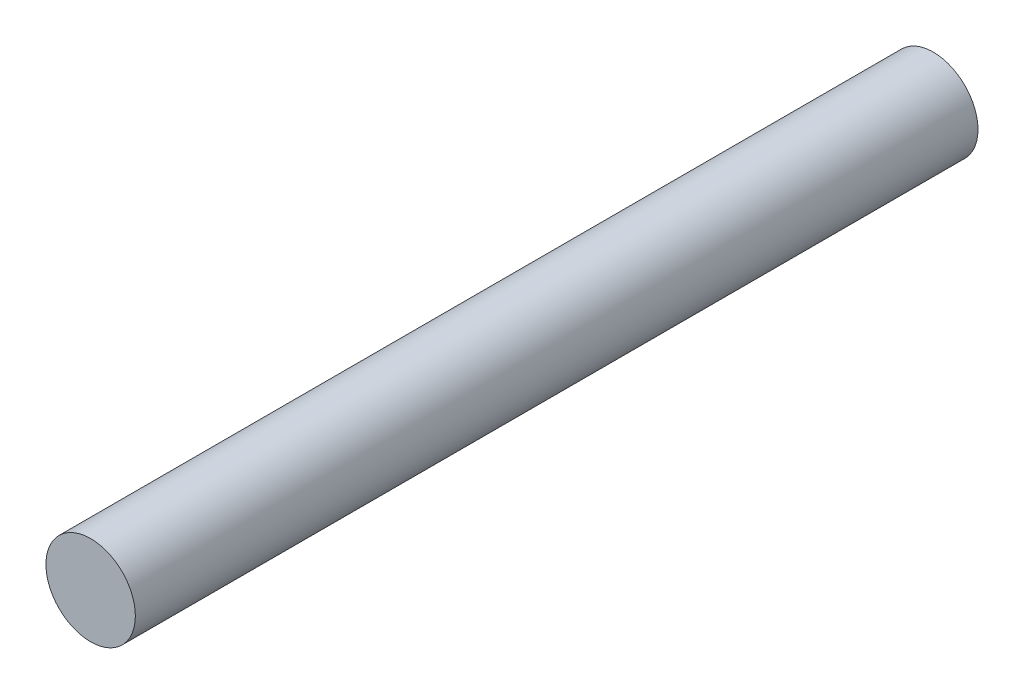
ISO-10303-21;
HEADER;
FILE_DESCRIPTION(('STEP AP214'),'2;1');
FILE_NAME('part.step','',(''),(''),'','','');
FILE_SCHEMA(('AUTOMOTIVE_DESIGN { 1 0 10303 214 1 1 1 1 }'));
ENDSEC;
DATA;
#1=APPLICATION_CONTEXT('core data for automotive mechanical design processes');
#2=APPLICATION_PROTOCOL_DEFINITION('international standard','automotive_design',2000,#1);
#3=PRODUCT_CONTEXT('',#1,'mechanical');
#4=PRODUCT('Part','Part','',(#3));
#5=PRODUCT_RELATED_PRODUCT_CATEGORY('part','',(#4));
#6=PRODUCT_DEFINITION_FORMATION('','',#4);
#7=PRODUCT_DEFINITION_CONTEXT('part definition',#1,'design');
#8=PRODUCT_DEFINITION('design','',#6,#7);
#9=PRODUCT_DEFINITION_SHAPE('','',#8);
#10=(LENGTH_UNIT() NAMED_UNIT(*) SI_UNIT(.MILLI.,.METRE.));
#11=(NAMED_UNIT(*) PLANE_ANGLE_UNIT() SI_UNIT($,.RADIAN.));
#12=(NAMED_UNIT(*) SI_UNIT($,.STERADIAN.) SOLID_ANGLE_UNIT());
#13=UNCERTAINTY_MEASURE_WITH_UNIT(LENGTH_MEASURE(1.E-05),#10,'distance_accuracy_value','');
#14=(GEOMETRIC_REPRESENTATION_CONTEXT(3) GLOBAL_UNCERTAINTY_ASSIGNED_CONTEXT((#13)) GLOBAL_UNIT_ASSIGNED_CONTEXT((#10,
#11,#12)) REPRESENTATION_CONTEXT('',''));
#15=CARTESIAN_POINT('',(0.,0.,0.));
#16=DIRECTION('',(0.,0.,1.));
#17=DIRECTION('',(1.,0.,0.));
#18=AXIS2_PLACEMENT_3D('',#15,#16,#17);
#19=CARTESIAN_POINT('',(0.,0.,650.));
#20=DIRECTION('',(0.,0.,-1.));
#21=DIRECTION('',(-1.,0.,0.));
#22=AXIS2_PLACEMENT_3D('',#19,#20,#21);
#23=CYLINDRICAL_SURFACE('',#22,34.5);
#24=CARTESIAN_POINT('',(0.,0.,650.));
#25=DIRECTION('',(0.,0.,1.));
#26=DIRECTION('',(1.,0.,0.));
#27=AXIS2_PLACEMENT_3D('',#24,#25,#26);
#28=CIRCLE('',#27,34.5);
#29=CARTESIAN_POINT('',(34.5,0.,650.));
#30=VERTEX_POINT('',#29);
#31=EDGE_CURVE('E10',#30,#30,#28,.T.);
#32=ORIENTED_EDGE('',*,*,#31,.F.);
#33=EDGE_LOOP('',(#32));
#34=FACE_BOUND('',#33,.T.);
#35=CARTESIAN_POINT('',(0.,0.,0.));
#36=DIRECTION('',(0.,0.,1.));
#37=DIRECTION('',(1.,0.,0.));
#38=AXIS2_PLACEMENT_3D('',#35,#36,#37);
#39=CIRCLE('',#38,34.5);
#40=CARTESIAN_POINT('',(34.5,0.,0.));
#41=VERTEX_POINT('',#40);
#42=EDGE_CURVE('E46',#41,#41,#39,.T.);
#43=ORIENTED_EDGE('',*,*,#42,.T.);
#44=EDGE_LOOP('',(#43));
#45=FACE_BOUND('',#44,.T.);
#46=ADVANCED_FACE('F43',(#34,#45),#23,.T.);
#47=CARTESIAN_POINT('',(0.,0.,650.));
#48=DIRECTION('',(0.,0.,1.));
#49=DIRECTION('',(1.,0.,0.));
#50=AXIS2_PLACEMENT_3D('',#47,#48,#49);
#51=PLANE('',#50);
#52=ORIENTED_EDGE('',*,*,#31,.T.);
#53=EDGE_LOOP('',(#52));
#54=FACE_BOUND('',#53,.T.);
#55=ADVANCED_FACE('F78',(#54),#51,.T.);
#56=CARTESIAN_POINT('',(0.,0.,0.));
#57=DIRECTION('',(0.,0.,1.));
#58=DIRECTION('',(1.,0.,0.));
#59=AXIS2_PLACEMENT_3D('',#56,#57,#58);
#60=PLANE('',#59);
#61=ORIENTED_EDGE('',*,*,#42,.F.);
#62=EDGE_LOOP('',(#61));
#63=FACE_BOUND('',#62,.T.);
#64=ADVANCED_FACE('F80',(#63),#60,.F.);
#65=CLOSED_SHELL('',(#46,#55,#64));
#66=CARTESIAN_POINT('',(0.,0.,648.));
#67=DIRECTION('',(0.,0.,-1.));
#68=DIRECTION('',(-1.,0.,0.));
#69=AXIS2_PLACEMENT_3D('',#66,#67,#68);
#70=CYLINDRICAL_SURFACE('',#69,32.5);
#71=CARTESIAN_POINT('',(0.,0.,648.));
#72=DIRECTION('',(0.,0.,1.));
#73=DIRECTION('',(1.,0.,0.));
#74=AXIS2_PLACEMENT_3D('',#71,#72,#73);
#75=CIRCLE('',#74,32.5);
#76=CARTESIAN_POINT('',(32.5,0.,648.));
#77=VERTEX_POINT('',#76);
#78=EDGE_CURVE('E53',#77,#77,#75,.T.);
#79=ORIENTED_EDGE('',*,*,#78,.T.);
#80=EDGE_LOOP('',(#79));
#81=FACE_BOUND('',#80,.T.);
#82=CARTESIAN_POINT('',(0.,0.,2.));
#83=DIRECTION('',(0.,0.,1.));
#84=DIRECTION('',(1.,0.,0.));
#85=AXIS2_PLACEMENT_3D('',#82,#83,#84);
#86=CIRCLE('',#85,32.5);
#87=CARTESIAN_POINT('',(32.5,0.,2.));
#88=VERTEX_POINT('',#87);
#89=EDGE_CURVE('E55',#88,#88,#86,.T.);
#90=ORIENTED_EDGE('',*,*,#89,.F.);
#91=EDGE_LOOP('',(#90));
#92=FACE_BOUND('',#91,.T.);
#93=ADVANCED_FACE('F61',(#81,#92),#70,.F.);
#94=CARTESIAN_POINT('',(0.,0.,648.));
#95=DIRECTION('',(0.,0.,1.));
#96=DIRECTION('',(1.,0.,0.));
#97=AXIS2_PLACEMENT_3D('',#94,#95,#96);
#98=PLANE('',#97);
#99=ORIENTED_EDGE('',*,*,#78,.F.);
#100=EDGE_LOOP('',(#99));
#101=FACE_BOUND('',#100,.T.);
#102=ADVANCED_FACE('F64',(#101),#98,.F.);
#103=CARTESIAN_POINT('',(0.,0.,2.));
#104=DIRECTION('',(0.,0.,1.));
#105=DIRECTION('',(1.,0.,0.));
#106=AXIS2_PLACEMENT_3D('',#103,#104,#105);
#107=PLANE('',#106);
#108=ORIENTED_EDGE('',*,*,#89,.T.);
#109=EDGE_LOOP('',(#108));
#110=FACE_BOUND('',#109,.T.);
#111=ADVANCED_FACE('F66',(#110),#107,.T.);
#112=CLOSED_SHELL('',(#93,#102,#111));
#113=ORIENTED_CLOSED_SHELL('',*,#112,.T.);
#114=BREP_WITH_VOIDS('B2',#65,(#113));
#115=ADVANCED_BREP_SHAPE_REPRESENTATION('',(#18,#114),#14);
#116=SHAPE_DEFINITION_REPRESENTATION(#9,#115);
ENDSEC;
END-ISO-10303-21;
